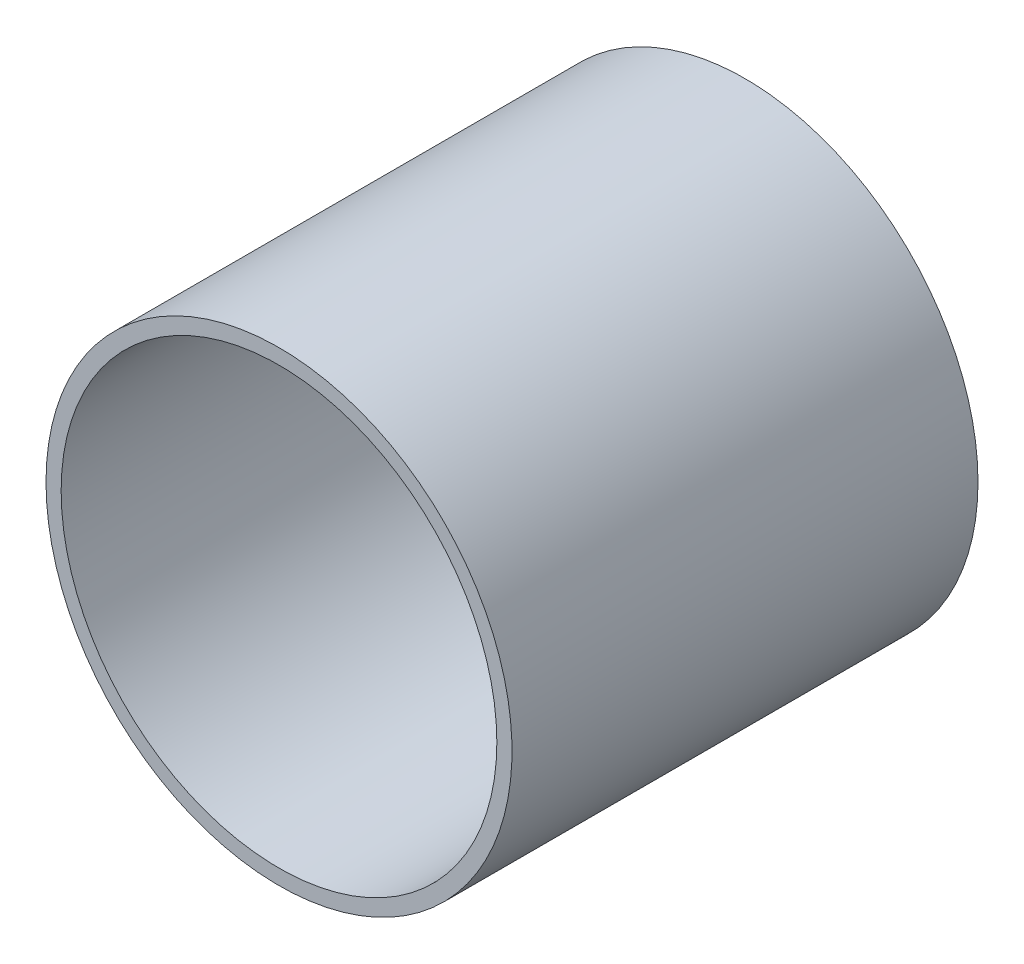
ISO-10303-21;
HEADER;
FILE_DESCRIPTION(('STEP AP214'),'2;1');
FILE_NAME('part.step','',(''),(''),'','','');
FILE_SCHEMA(('AUTOMOTIVE_DESIGN { 1 0 10303 214 1 1 1 1 }'));
ENDSEC;
DATA;
#1=APPLICATION_CONTEXT('core data for automotive mechanical design processes');
#2=APPLICATION_PROTOCOL_DEFINITION('international standard','automotive_design',2000,#1);
#3=PRODUCT_CONTEXT('',#1,'mechanical');
#4=PRODUCT('Part','Part','',(#3));
#5=PRODUCT_RELATED_PRODUCT_CATEGORY('part','',(#4));
#6=PRODUCT_DEFINITION_FORMATION('','',#4);
#7=PRODUCT_DEFINITION_CONTEXT('part definition',#1,'design');
#8=PRODUCT_DEFINITION('design','',#6,#7);
#9=PRODUCT_DEFINITION_SHAPE('','',#8);
#10=(LENGTH_UNIT() NAMED_UNIT(*) SI_UNIT(.MILLI.,.METRE.));
#11=(NAMED_UNIT(*) PLANE_ANGLE_UNIT() SI_UNIT($,.RADIAN.));
#12=(NAMED_UNIT(*) SI_UNIT($,.STERADIAN.) SOLID_ANGLE_UNIT());
#13=UNCERTAINTY_MEASURE_WITH_UNIT(LENGTH_MEASURE(1.E-05),#10,'distance_accuracy_value','');
#14=(GEOMETRIC_REPRESENTATION_CONTEXT(3) GLOBAL_UNCERTAINTY_ASSIGNED_CONTEXT((#13)) GLOBAL_UNIT_ASSIGNED_CONTEXT((#10,
#11,#12)) REPRESENTATION_CONTEXT('',''));
#15=CARTESIAN_POINT('',(0.,0.,0.));
#16=DIRECTION('',(0.,0.,1.));
#17=DIRECTION('',(1.,0.,0.));
#18=AXIS2_PLACEMENT_3D('',#15,#16,#17);
#19=CARTESIAN_POINT('',(0.,0.,37.9095));
#20=DIRECTION('',(0.,0.,1.));
#21=DIRECTION('',(-1.,0.,0.));
#22=AXIS2_PLACEMENT_3D('',#19,#20,#21);
#23=CYLINDRICAL_SURFACE('',#22,25.4);
#24=CARTESIAN_POINT('',(0.,0.,12.8905));
#25=DIRECTION('',(0.,0.,-1.));
#26=DIRECTION('',(-1.,0.,0.));
#27=AXIS2_PLACEMENT_3D('',#24,#25,#26);
#28=CIRCLE('',#27,25.4);
#29=CARTESIAN_POINT('',(-25.4,0.,12.8905));
#30=VERTEX_POINT('',#29);
#31=EDGE_CURVE('E59',#30,#30,#28,.F.);
#32=ORIENTED_EDGE('',*,*,#31,.F.);
#33=EDGE_LOOP('',(#32));
#34=FACE_BOUND('',#33,.T.);
#35=CARTESIAN_POINT('',(0.,0.,-37.9095));
#36=DIRECTION('',(0.,0.,-1.));
#37=DIRECTION('',(1.,0.,0.));
#38=AXIS2_PLACEMENT_3D('',#35,#36,#37);
#39=CIRCLE('',#38,25.4);
#40=CARTESIAN_POINT('',(25.4,0.,-37.9095));
#41=VERTEX_POINT('',#40);
#42=EDGE_CURVE('E29',#41,#41,#39,.T.);
#43=ORIENTED_EDGE('',*,*,#42,.F.);
#44=EDGE_LOOP('',(#43));
#45=FACE_BOUND('',#44,.T.);
#46=ADVANCED_FACE('F19',(#34,#45),#23,.T.);
#47=CARTESIAN_POINT('',(0.,0.,37.9095));
#48=DIRECTION('',(0.,0.,1.));
#49=DIRECTION('',(-1.,0.,0.));
#50=AXIS2_PLACEMENT_3D('',#47,#48,#49);
#51=CYLINDRICAL_SURFACE('',#50,23.749);
#52=CARTESIAN_POINT('',(0.,0.,12.8905));
#53=DIRECTION('',(0.,0.,-1.));
#54=DIRECTION('',(-1.,0.,0.));
#55=AXIS2_PLACEMENT_3D('',#52,#53,#54);
#56=CIRCLE('',#55,23.749);
#57=CARTESIAN_POINT('',(-23.749,0.,12.8905));
#58=VERTEX_POINT('',#57);
#59=EDGE_CURVE('E23',#58,#58,#56,.F.);
#60=ORIENTED_EDGE('',*,*,#59,.T.);
#61=EDGE_LOOP('',(#60));
#62=FACE_BOUND('',#61,.T.);
#63=CARTESIAN_POINT('',(0.,0.,-37.9095));
#64=DIRECTION('',(0.,0.,-1.));
#65=DIRECTION('',(-1.,0.,0.));
#66=AXIS2_PLACEMENT_3D('',#63,#64,#65);
#67=CIRCLE('',#66,23.749);
#68=CARTESIAN_POINT('',(-23.749,0.,-37.9095));
#69=VERTEX_POINT('',#68);
#70=EDGE_CURVE('E12',#69,#69,#67,.T.);
#71=ORIENTED_EDGE('',*,*,#70,.T.);
#72=EDGE_LOOP('',(#71));
#73=FACE_BOUND('',#72,.T.);
#74=ADVANCED_FACE('F36',(#62,#73),#51,.F.);
#75=CARTESIAN_POINT('',(0.,0.,-37.9095));
#76=DIRECTION('',(0.,0.,-1.));
#77=DIRECTION('',(0.,-1.,0.));
#78=AXIS2_PLACEMENT_3D('',#75,#76,#77);
#79=PLANE('',#78);
#80=ORIENTED_EDGE('',*,*,#42,.T.);
#81=EDGE_LOOP('',(#80));
#82=FACE_BOUND('',#81,.T.);
#83=ORIENTED_EDGE('',*,*,#70,.F.);
#84=EDGE_LOOP('',(#83));
#85=FACE_BOUND('',#84,.T.);
#86=ADVANCED_FACE('F21',(#82,#85),#79,.T.);
#87=CARTESIAN_POINT('',(0.,0.,12.8905));
#88=DIRECTION('',(0.,0.,-1.));
#89=DIRECTION('',(0.,-1.,0.));
#90=AXIS2_PLACEMENT_3D('',#87,#88,#89);
#91=PLANE('',#90);
#92=ORIENTED_EDGE('',*,*,#31,.T.);
#93=EDGE_LOOP('',(#92));
#94=FACE_BOUND('',#93,.T.);
#95=ORIENTED_EDGE('',*,*,#59,.F.);
#96=EDGE_LOOP('',(#95));
#97=FACE_BOUND('',#96,.T.);
#98=ADVANCED_FACE('F45',(#94,#97),#91,.F.);
#99=CLOSED_SHELL('',(#46,#74,#86,#98));
#100=MANIFOLD_SOLID_BREP('B1',#99);
#101=ADVANCED_BREP_SHAPE_REPRESENTATION('',(#18,#100),#14);
#102=SHAPE_DEFINITION_REPRESENTATION(#9,#101);
ENDSEC;
END-ISO-10303-21;
